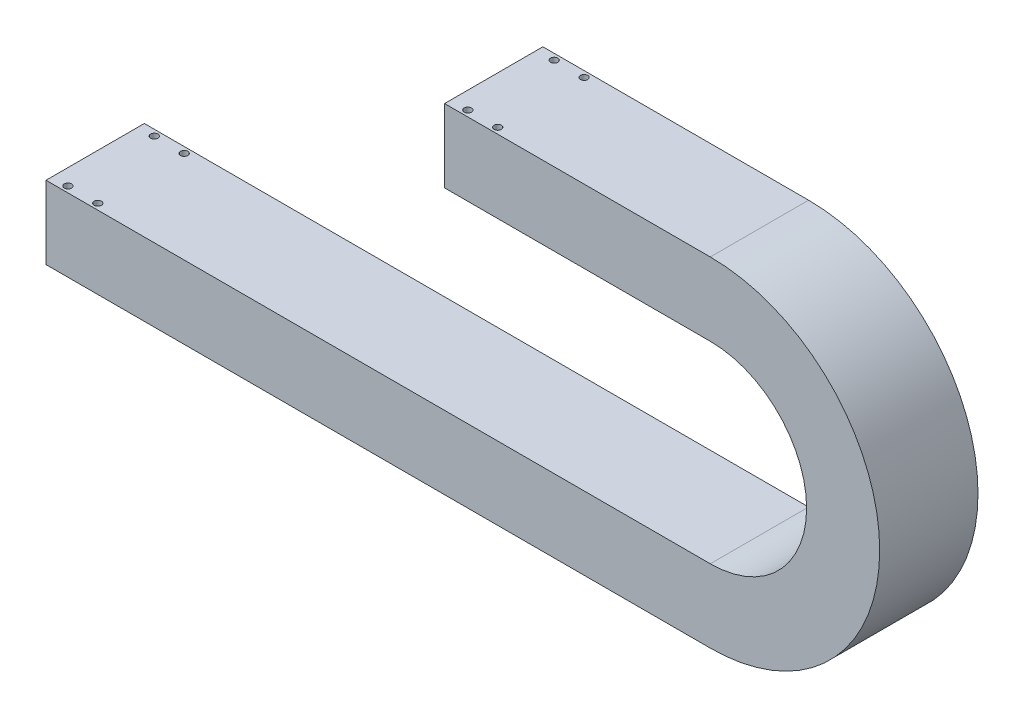
ISO-10303-21;
HEADER;
FILE_DESCRIPTION(('STEP AP214'),'2;1');
FILE_NAME('part.step','',(''),(''),'','','');
FILE_SCHEMA(('AUTOMOTIVE_DESIGN { 1 0 10303 214 1 1 1 1 }'));
ENDSEC;
DATA;
#1=APPLICATION_CONTEXT('core data for automotive mechanical design processes');
#2=APPLICATION_PROTOCOL_DEFINITION('international standard','automotive_design',2000,#1);
#3=PRODUCT_CONTEXT('',#1,'mechanical');
#4=PRODUCT('Part','Part','',(#3));
#5=PRODUCT_RELATED_PRODUCT_CATEGORY('part','',(#4));
#6=PRODUCT_DEFINITION_FORMATION('','',#4);
#7=PRODUCT_DEFINITION_CONTEXT('part definition',#1,'design');
#8=PRODUCT_DEFINITION('design','',#6,#7);
#9=PRODUCT_DEFINITION_SHAPE('','',#8);
#10=(LENGTH_UNIT() NAMED_UNIT(*) SI_UNIT(.MILLI.,.METRE.));
#11=(NAMED_UNIT(*) PLANE_ANGLE_UNIT() SI_UNIT($,.RADIAN.));
#12=(NAMED_UNIT(*) SI_UNIT($,.STERADIAN.) SOLID_ANGLE_UNIT());
#13=UNCERTAINTY_MEASURE_WITH_UNIT(LENGTH_MEASURE(1.E-05),#10,'distance_accuracy_value','');
#14=(GEOMETRIC_REPRESENTATION_CONTEXT(3) GLOBAL_UNCERTAINTY_ASSIGNED_CONTEXT((#13)) GLOBAL_UNIT_ASSIGNED_CONTEXT((#10,
#11,#12)) REPRESENTATION_CONTEXT('',''));
#15=CARTESIAN_POINT('',(0.,0.,0.));
#16=DIRECTION('',(0.,0.,1.));
#17=DIRECTION('',(1.,0.,0.));
#18=AXIS2_PLACEMENT_3D('',#15,#16,#17);
#19=CARTESIAN_POINT('',(500.,172.5,37.));
#20=DIRECTION('',(0.,-1.,0.));
#21=DIRECTION('',(0.,0.,-1.));
#22=AXIS2_PLACEMENT_3D('',#19,#20,#21);
#23=PLANE('',#22);
#24=CARTESIAN_POINT('',(313.,172.5,-32.5));
#25=DIRECTION('',(0.,-1.,0.));
#26=DIRECTION('',(0.,0.,-1.));
#27=AXIS2_PLACEMENT_3D('',#24,#25,#26);
#28=CIRCLE('',#27,2.74999999999997);
#29=CARTESIAN_POINT('',(313.,172.5,-35.25));
#30=VERTEX_POINT('',#29);
#31=EDGE_CURVE('E341',#30,#30,#28,.F.);
#32=ORIENTED_EDGE('',*,*,#31,.T.);
#33=EDGE_LOOP('',(#32));
#34=FACE_BOUND('',#33,.T.);
#35=CARTESIAN_POINT('',(335.5,172.5,-32.5));
#36=DIRECTION('',(0.,-1.,0.));
#37=DIRECTION('',(0.,0.,-1.));
#38=AXIS2_PLACEMENT_3D('',#35,#36,#37);
#39=CIRCLE('',#38,2.74999999999997);
#40=CARTESIAN_POINT('',(335.5,172.5,-35.25));
#41=VERTEX_POINT('',#40);
#42=EDGE_CURVE('E345',#41,#41,#39,.F.);
#43=ORIENTED_EDGE('',*,*,#42,.T.);
#44=EDGE_LOOP('',(#43));
#45=FACE_BOUND('',#44,.T.);
#46=CARTESIAN_POINT('',(335.5,172.5,32.5));
#47=DIRECTION('',(0.,-1.,0.));
#48=DIRECTION('',(0.,0.,-1.));
#49=AXIS2_PLACEMENT_3D('',#46,#47,#48);
#50=CIRCLE('',#49,2.74999999999997);
#51=CARTESIAN_POINT('',(335.5,172.5,29.75));
#52=VERTEX_POINT('',#51);
#53=EDGE_CURVE('E348',#52,#52,#50,.F.);
#54=ORIENTED_EDGE('',*,*,#53,.T.);
#55=EDGE_LOOP('',(#54));
#56=FACE_BOUND('',#55,.T.);
#57=DIRECTION('',(1.,0.,0.));
#58=VECTOR('',#57,1.);
#59=CARTESIAN_POINT('',(500.,172.5,-37.));
#60=LINE('',#59,#58);
#61=CARTESIAN_POINT('',(500.,172.5,-37.));
#62=VERTEX_POINT('',#61);
#63=CARTESIAN_POINT('',(300.,172.5,-37.));
#64=VERTEX_POINT('',#63);
#65=EDGE_CURVE('E252',#62,#64,#60,.F.);
#66=ORIENTED_EDGE('',*,*,#65,.F.);
#67=DIRECTION('',(0.,0.,-1.));
#68=VECTOR('',#67,1.);
#69=CARTESIAN_POINT('',(500.,172.5,37.));
#70=LINE('',#69,#68);
#71=CARTESIAN_POINT('',(500.,172.5,37.));
#72=VERTEX_POINT('',#71);
#73=EDGE_CURVE('E278',#72,#62,#70,.T.);
#74=ORIENTED_EDGE('',*,*,#73,.F.);
#75=DIRECTION('',(1.,0.,0.));
#76=VECTOR('',#75,1.);
#77=CARTESIAN_POINT('',(500.,172.5,37.));
#78=LINE('',#77,#76);
#79=CARTESIAN_POINT('',(300.,172.5,37.));
#80=VERTEX_POINT('',#79);
#81=EDGE_CURVE('E230',#72,#80,#78,.F.);
#82=ORIENTED_EDGE('',*,*,#81,.T.);
#83=DIRECTION('',(0.,0.,-1.));
#84=VECTOR('',#83,1.);
#85=CARTESIAN_POINT('',(300.,172.5,37.));
#86=LINE('',#85,#84);
#87=EDGE_CURVE('E43',#80,#64,#86,.T.);
#88=ORIENTED_EDGE('',*,*,#87,.T.);
#89=EDGE_LOOP('',(#66,#74,#82,#88));
#90=FACE_BOUND('',#89,.T.);
#91=CARTESIAN_POINT('',(313.,172.5,32.5));
#92=DIRECTION('',(0.,-1.,0.));
#93=DIRECTION('',(0.,0.,-1.));
#94=AXIS2_PLACEMENT_3D('',#91,#92,#93);
#95=CIRCLE('',#94,2.74999999999997);
#96=CARTESIAN_POINT('',(313.,172.5,29.75));
#97=VERTEX_POINT('',#96);
#98=EDGE_CURVE('E354',#97,#97,#95,.F.);
#99=ORIENTED_EDGE('',*,*,#98,.T.);
#100=EDGE_LOOP('',(#99));
#101=FACE_BOUND('',#100,.T.);
#102=ADVANCED_FACE('F35',(#34,#45,#56,#90,#101),#23,.T.);
#103=CARTESIAN_POINT('',(300.,172.5,37.));
#104=DIRECTION('',(-1.,0.,0.));
#105=DIRECTION('',(0.,0.,1.));
#106=AXIS2_PLACEMENT_3D('',#103,#104,#105);
#107=PLANE('',#106);
#108=DIRECTION('',(0.,1.,0.));
#109=VECTOR('',#108,1.);
#110=CARTESIAN_POINT('',(300.,172.5,-37.));
#111=LINE('',#110,#109);
#112=CARTESIAN_POINT('',(300.,227.5,-37.));
#113=VERTEX_POINT('',#112);
#114=EDGE_CURVE('E249',#64,#113,#111,.T.);
#115=ORIENTED_EDGE('',*,*,#114,.F.);
#116=ORIENTED_EDGE('',*,*,#87,.F.);
#117=DIRECTION('',(0.,1.,0.));
#118=VECTOR('',#117,1.);
#119=CARTESIAN_POINT('',(300.,172.5,37.));
#120=LINE('',#119,#118);
#121=CARTESIAN_POINT('',(300.,227.5,37.));
#122=VERTEX_POINT('',#121);
#123=EDGE_CURVE('E226',#80,#122,#120,.T.);
#124=ORIENTED_EDGE('',*,*,#123,.T.);
#125=DIRECTION('',(0.,0.,-1.));
#126=VECTOR('',#125,1.);
#127=CARTESIAN_POINT('',(300.,227.5,37.));
#128=LINE('',#127,#126);
#129=EDGE_CURVE('E11',#122,#113,#128,.T.);
#130=ORIENTED_EDGE('',*,*,#129,.T.);
#131=EDGE_LOOP('',(#115,#116,#124,#130));
#132=FACE_BOUND('',#131,.T.);
#133=DIRECTION('',(0.,0.,-1.));
#134=VECTOR('',#133,1.);
#135=CARTESIAN_POINT('',(300.,184.5,37.));
#136=LINE('',#135,#134);
#137=CARTESIAN_POINT('',(300.,184.5,25.));
#138=VERTEX_POINT('',#137);
#139=CARTESIAN_POINT('',(300.,184.5,-25.));
#140=VERTEX_POINT('',#139);
#141=EDGE_CURVE('E204',#138,#140,#136,.T.);
#142=ORIENTED_EDGE('',*,*,#141,.T.);
#143=DIRECTION('',(0.,1.,0.));
#144=VECTOR('',#143,1.);
#145=CARTESIAN_POINT('',(300.,172.5,-25.));
#146=LINE('',#145,#144);
#147=CARTESIAN_POINT('',(300.,215.5,-25.));
#148=VERTEX_POINT('',#147);
#149=EDGE_CURVE('E174',#140,#148,#146,.T.);
#150=ORIENTED_EDGE('',*,*,#149,.T.);
#151=DIRECTION('',(0.,0.,-1.));
#152=VECTOR('',#151,1.);
#153=CARTESIAN_POINT('',(300.,215.5,37.));
#154=LINE('',#153,#152);
#155=CARTESIAN_POINT('',(300.,215.5,25.));
#156=VERTEX_POINT('',#155);
#157=EDGE_CURVE('E173',#156,#148,#154,.T.);
#158=ORIENTED_EDGE('',*,*,#157,.F.);
#159=DIRECTION('',(0.,1.,0.));
#160=VECTOR('',#159,1.);
#161=CARTESIAN_POINT('',(300.,172.5,25.));
#162=LINE('',#161,#160);
#163=EDGE_CURVE('E50',#138,#156,#162,.T.);
#164=ORIENTED_EDGE('',*,*,#163,.F.);
#165=EDGE_LOOP('',(#142,#150,#158,#164));
#166=FACE_BOUND('',#165,.T.);
#167=ADVANCED_FACE('F286',(#132,#166),#107,.T.);
#168=CARTESIAN_POINT('',(0.,-27.5,37.));
#169=DIRECTION('',(-1.,0.,0.));
#170=DIRECTION('',(0.,0.,1.));
#171=AXIS2_PLACEMENT_3D('',#168,#169,#170);
#172=PLANE('',#171);
#173=DIRECTION('',(0.,1.,0.));
#174=VECTOR('',#173,1.);
#175=CARTESIAN_POINT('',(0.,-27.5,-37.));
#176=LINE('',#175,#174);
#177=CARTESIAN_POINT('',(0.,-27.5,-37.));
#178=VERTEX_POINT('',#177);
#179=CARTESIAN_POINT('',(0.,27.5,-37.));
#180=VERTEX_POINT('',#179);
#181=EDGE_CURVE('E261',#178,#180,#176,.T.);
#182=ORIENTED_EDGE('',*,*,#181,.F.);
#183=DIRECTION('',(0.,0.,-1.));
#184=VECTOR('',#183,1.);
#185=CARTESIAN_POINT('',(0.,-27.5,37.));
#186=LINE('',#185,#184);
#187=CARTESIAN_POINT('',(0.,-27.5,37.));
#188=VERTEX_POINT('',#187);
#189=EDGE_CURVE('E272',#188,#178,#186,.T.);
#190=ORIENTED_EDGE('',*,*,#189,.F.);
#191=DIRECTION('',(0.,1.,0.));
#192=VECTOR('',#191,1.);
#193=CARTESIAN_POINT('',(0.,-27.5,37.));
#194=LINE('',#193,#192);
#195=CARTESIAN_POINT('',(0.,27.5,37.));
#196=VERTEX_POINT('',#195);
#197=EDGE_CURVE('E239',#188,#196,#194,.T.);
#198=ORIENTED_EDGE('',*,*,#197,.T.);
#199=DIRECTION('',(0.,0.,-1.));
#200=VECTOR('',#199,1.);
#201=CARTESIAN_POINT('',(0.,27.5,37.));
#202=LINE('',#201,#200);
#203=EDGE_CURVE('E274',#196,#180,#202,.T.);
#204=ORIENTED_EDGE('',*,*,#203,.T.);
#205=EDGE_LOOP('',(#182,#190,#198,#204));
#206=FACE_BOUND('',#205,.T.);
#207=DIRECTION('',(0.,0.,-1.));
#208=VECTOR('',#207,1.);
#209=CARTESIAN_POINT('',(0.,-15.5,37.));
#210=LINE('',#209,#208);
#211=CARTESIAN_POINT('',(0.,-15.5,25.));
#212=VERTEX_POINT('',#211);
#213=CARTESIAN_POINT('',(0.,-15.5,-25.));
#214=VERTEX_POINT('',#213);
#215=EDGE_CURVE('E188',#212,#214,#210,.T.);
#216=ORIENTED_EDGE('',*,*,#215,.T.);
#217=DIRECTION('',(0.,1.,0.));
#218=VECTOR('',#217,1.);
#219=CARTESIAN_POINT('',(0.,-27.5,-25.));
#220=LINE('',#219,#218);
#221=CARTESIAN_POINT('',(0.,15.5,-25.));
#222=VERTEX_POINT('',#221);
#223=EDGE_CURVE('E190',#214,#222,#220,.T.);
#224=ORIENTED_EDGE('',*,*,#223,.T.);
#225=DIRECTION('',(0.,0.,-1.));
#226=VECTOR('',#225,1.);
#227=CARTESIAN_POINT('',(0.,15.5,37.));
#228=LINE('',#227,#226);
#229=CARTESIAN_POINT('',(0.,15.5,25.));
#230=VERTEX_POINT('',#229);
#231=EDGE_CURVE('E210',#230,#222,#228,.T.);
#232=ORIENTED_EDGE('',*,*,#231,.F.);
#233=DIRECTION('',(0.,1.,0.));
#234=VECTOR('',#233,1.);
#235=CARTESIAN_POINT('',(0.,-27.5,25.));
#236=LINE('',#235,#234);
#237=EDGE_CURVE('E57',#212,#230,#236,.T.);
#238=ORIENTED_EDGE('',*,*,#237,.F.);
#239=EDGE_LOOP('',(#216,#224,#232,#238));
#240=FACE_BOUND('',#239,.T.);
#241=ADVANCED_FACE('F315',(#206,#240),#172,.T.);
#242=CARTESIAN_POINT('',(500.,227.5,37.));
#243=DIRECTION('',(0.,-1.,0.));
#244=DIRECTION('',(0.,0.,-1.));
#245=AXIS2_PLACEMENT_3D('',#242,#243,#244);
#246=PLANE('',#245);
#247=CARTESIAN_POINT('',(313.,227.5,-32.5));
#248=DIRECTION('',(0.,1.,0.));
#249=DIRECTION('',(0.,0.,1.));
#250=AXIS2_PLACEMENT_3D('',#247,#248,#249);
#251=CIRCLE('',#250,2.74999999999997);
#252=CARTESIAN_POINT('',(313.,227.5,-29.75));
#253=VERTEX_POINT('',#252);
#254=EDGE_CURVE('E437',#253,#253,#251,.T.);
#255=ORIENTED_EDGE('',*,*,#254,.F.);
#256=EDGE_LOOP('',(#255));
#257=FACE_BOUND('',#256,.T.);
#258=CARTESIAN_POINT('',(335.5,227.5,-32.5));
#259=DIRECTION('',(0.,1.,0.));
#260=DIRECTION('',(0.,0.,1.));
#261=AXIS2_PLACEMENT_3D('',#258,#259,#260);
#262=CIRCLE('',#261,2.74999999999997);
#263=CARTESIAN_POINT('',(335.5,227.5,-29.75));
#264=VERTEX_POINT('',#263);
#265=EDGE_CURVE('E441',#264,#264,#262,.T.);
#266=ORIENTED_EDGE('',*,*,#265,.F.);
#267=EDGE_LOOP('',(#266));
#268=FACE_BOUND('',#267,.T.);
#269=CARTESIAN_POINT('',(335.5,227.5,32.5));
#270=DIRECTION('',(0.,1.,0.));
#271=DIRECTION('',(0.,0.,1.));
#272=AXIS2_PLACEMENT_3D('',#269,#270,#271);
#273=CIRCLE('',#272,2.74999999999997);
#274=CARTESIAN_POINT('',(335.5,227.5,35.25));
#275=VERTEX_POINT('',#274);
#276=EDGE_CURVE('E351',#275,#275,#273,.T.);
#277=ORIENTED_EDGE('',*,*,#276,.F.);
#278=EDGE_LOOP('',(#277));
#279=FACE_BOUND('',#278,.T.);
#280=CARTESIAN_POINT('',(313.,227.5,32.5));
#281=DIRECTION('',(0.,1.,0.));
#282=DIRECTION('',(0.,0.,1.));
#283=AXIS2_PLACEMENT_3D('',#280,#281,#282);
#284=CIRCLE('',#283,2.74999999999997);
#285=CARTESIAN_POINT('',(313.,227.5,35.25));
#286=VERTEX_POINT('',#285);
#287=EDGE_CURVE('E350',#286,#286,#284,.T.);
#288=ORIENTED_EDGE('',*,*,#287,.F.);
#289=EDGE_LOOP('',(#288));
#290=FACE_BOUND('',#289,.T.);
#291=DIRECTION('',(1.,0.,0.));
#292=VECTOR('',#291,1.);
#293=CARTESIAN_POINT('',(500.,227.5,-37.));
#294=LINE('',#293,#292);
#295=CARTESIAN_POINT('',(500.,227.5,-37.));
#296=VERTEX_POINT('',#295);
#297=EDGE_CURVE('E213',#296,#113,#294,.F.);
#298=ORIENTED_EDGE('',*,*,#297,.T.);
#299=ORIENTED_EDGE('',*,*,#129,.F.);
#300=DIRECTION('',(1.,0.,0.));
#301=VECTOR('',#300,1.);
#302=CARTESIAN_POINT('',(500.,227.5,37.));
#303=LINE('',#302,#301);
#304=CARTESIAN_POINT('',(500.,227.5,37.));
#305=VERTEX_POINT('',#304);
#306=EDGE_CURVE('E224',#305,#122,#303,.F.);
#307=ORIENTED_EDGE('',*,*,#306,.F.);
#308=DIRECTION('',(0.,0.,-1.));
#309=VECTOR('',#308,1.);
#310=CARTESIAN_POINT('',(500.,227.5,37.));
#311=LINE('',#310,#309);
#312=EDGE_CURVE('E246',#305,#296,#311,.T.);
#313=ORIENTED_EDGE('',*,*,#312,.T.);
#314=EDGE_LOOP('',(#298,#299,#307,#313));
#315=FACE_BOUND('',#314,.T.);
#316=ADVANCED_FACE('F37',(#257,#268,#279,#290,#315),#246,.F.);
#317=CARTESIAN_POINT('',(500.,100.,37.));
#318=DIRECTION('',(0.,0.,-1.));
#319=DIRECTION('',(-1.,0.,0.));
#320=AXIS2_PLACEMENT_3D('',#317,#318,#319);
#321=CYLINDRICAL_SURFACE('',#320,72.5);
#322=CARTESIAN_POINT('',(500.,100.,-37.));
#323=DIRECTION('',(0.,0.,1.));
#324=DIRECTION('',(1.,0.,0.));
#325=AXIS2_PLACEMENT_3D('',#322,#323,#324);
#326=CIRCLE('',#325,72.5);
#327=CARTESIAN_POINT('',(500.,27.5,-37.));
#328=VERTEX_POINT('',#327);
#329=EDGE_CURVE('E255',#328,#62,#326,.T.);
#330=ORIENTED_EDGE('',*,*,#329,.F.);
#331=DIRECTION('',(0.,0.,-1.));
#332=VECTOR('',#331,1.);
#333=CARTESIAN_POINT('',(500.,27.5,37.));
#334=LINE('',#333,#332);
#335=CARTESIAN_POINT('',(500.,27.5,37.));
#336=VERTEX_POINT('',#335);
#337=EDGE_CURVE('E276',#336,#328,#334,.T.);
#338=ORIENTED_EDGE('',*,*,#337,.F.);
#339=CARTESIAN_POINT('',(500.,100.,37.));
#340=DIRECTION('',(0.,0.,1.));
#341=DIRECTION('',(1.,0.,0.));
#342=AXIS2_PLACEMENT_3D('',#339,#340,#341);
#343=CIRCLE('',#342,72.5);
#344=EDGE_CURVE('E233',#336,#72,#343,.T.);
#345=ORIENTED_EDGE('',*,*,#344,.T.);
#346=ORIENTED_EDGE('',*,*,#73,.T.);
#347=EDGE_LOOP('',(#330,#338,#345,#346));
#348=FACE_BOUND('',#347,.T.);
#349=ADVANCED_FACE('F295',(#348),#321,.F.);
#350=CARTESIAN_POINT('',(0.,27.5,37.));
#351=DIRECTION('',(0.,1.,0.));
#352=DIRECTION('',(0.,0.,1.));
#353=AXIS2_PLACEMENT_3D('',#350,#351,#352);
#354=PLANE('',#353);
#355=CARTESIAN_POINT('',(12.,27.5,-32.5));
#356=DIRECTION('',(0.,1.,0.));
#357=DIRECTION('',(0.,0.,1.));
#358=AXIS2_PLACEMENT_3D('',#355,#356,#357);
#359=CIRCLE('',#358,2.74999999999999);
#360=CARTESIAN_POINT('',(12.,27.5,-29.75));
#361=VERTEX_POINT('',#360);
#362=EDGE_CURVE('E362',#361,#361,#359,.T.);
#363=ORIENTED_EDGE('',*,*,#362,.F.);
#364=EDGE_LOOP('',(#363));
#365=FACE_BOUND('',#364,.T.);
#366=CARTESIAN_POINT('',(34.5,27.5,-32.5));
#367=DIRECTION('',(0.,1.,0.));
#368=DIRECTION('',(0.,0.,1.));
#369=AXIS2_PLACEMENT_3D('',#366,#367,#368);
#370=CIRCLE('',#369,2.75);
#371=CARTESIAN_POINT('',(34.5,27.5,-29.75));
#372=VERTEX_POINT('',#371);
#373=EDGE_CURVE('E368',#372,#372,#370,.T.);
#374=ORIENTED_EDGE('',*,*,#373,.F.);
#375=EDGE_LOOP('',(#374));
#376=FACE_BOUND('',#375,.T.);
#377=CARTESIAN_POINT('',(34.5,27.5,32.5));
#378=DIRECTION('',(0.,1.,0.));
#379=DIRECTION('',(0.,0.,1.));
#380=AXIS2_PLACEMENT_3D('',#377,#378,#379);
#381=CIRCLE('',#380,2.75);
#382=CARTESIAN_POINT('',(34.5,27.5,35.25));
#383=VERTEX_POINT('',#382);
#384=EDGE_CURVE('E374',#383,#383,#381,.T.);
#385=ORIENTED_EDGE('',*,*,#384,.F.);
#386=EDGE_LOOP('',(#385));
#387=FACE_BOUND('',#386,.T.);
#388=CARTESIAN_POINT('',(12.,27.5,32.5));
#389=DIRECTION('',(0.,1.,0.));
#390=DIRECTION('',(0.,0.,1.));
#391=AXIS2_PLACEMENT_3D('',#388,#389,#390);
#392=CIRCLE('',#391,2.74999999999999);
#393=CARTESIAN_POINT('',(12.,27.5,35.25));
#394=VERTEX_POINT('',#393);
#395=EDGE_CURVE('E180',#394,#394,#392,.T.);
#396=ORIENTED_EDGE('',*,*,#395,.F.);
#397=EDGE_LOOP('',(#396));
#398=FACE_BOUND('',#397,.T.);
#399=DIRECTION('',(1.,0.,0.));
#400=VECTOR('',#399,1.);
#401=CARTESIAN_POINT('',(0.,27.5,-37.));
#402=LINE('',#401,#400);
#403=EDGE_CURVE('E258',#180,#328,#402,.T.);
#404=ORIENTED_EDGE('',*,*,#403,.F.);
#405=ORIENTED_EDGE('',*,*,#203,.F.);
#406=DIRECTION('',(1.,0.,0.));
#407=VECTOR('',#406,1.);
#408=CARTESIAN_POINT('',(0.,27.5,37.));
#409=LINE('',#408,#407);
#410=EDGE_CURVE('E236',#196,#336,#409,.T.);
#411=ORIENTED_EDGE('',*,*,#410,.T.);
#412=ORIENTED_EDGE('',*,*,#337,.T.);
#413=EDGE_LOOP('',(#404,#405,#411,#412));
#414=FACE_BOUND('',#413,.T.);
#415=ADVANCED_FACE('F318',(#365,#376,#387,#398,#414),#354,.T.);
#416=CARTESIAN_POINT('',(0.,-27.5,37.));
#417=DIRECTION('',(0.,1.,0.));
#418=DIRECTION('',(0.,0.,1.));
#419=AXIS2_PLACEMENT_3D('',#416,#417,#418);
#420=PLANE('',#419);
#421=CARTESIAN_POINT('',(12.,-27.5,-32.5));
#422=DIRECTION('',(0.,1.,0.));
#423=DIRECTION('',(0.,0.,1.));
#424=AXIS2_PLACEMENT_3D('',#421,#422,#423);
#425=CIRCLE('',#424,2.74999999999999);
#426=CARTESIAN_POINT('',(12.,-27.5,-29.75));
#427=VERTEX_POINT('',#426);
#428=EDGE_CURVE('E365',#427,#427,#425,.T.);
#429=ORIENTED_EDGE('',*,*,#428,.T.);
#430=EDGE_LOOP('',(#429));
#431=FACE_BOUND('',#430,.T.);
#432=CARTESIAN_POINT('',(34.5,-27.5,-32.5));
#433=DIRECTION('',(0.,1.,0.));
#434=DIRECTION('',(0.,0.,1.));
#435=AXIS2_PLACEMENT_3D('',#432,#433,#434);
#436=CIRCLE('',#435,2.74999999999999);
#437=CARTESIAN_POINT('',(34.5,-27.5,-29.75));
#438=VERTEX_POINT('',#437);
#439=EDGE_CURVE('E371',#438,#438,#436,.T.);
#440=ORIENTED_EDGE('',*,*,#439,.T.);
#441=EDGE_LOOP('',(#440));
#442=FACE_BOUND('',#441,.T.);
#443=CARTESIAN_POINT('',(34.5,-27.5,32.5));
#444=DIRECTION('',(0.,1.,0.));
#445=DIRECTION('',(0.,0.,1.));
#446=AXIS2_PLACEMENT_3D('',#443,#444,#445);
#447=CIRCLE('',#446,2.74999999999999);
#448=CARTESIAN_POINT('',(34.5,-27.5,35.25));
#449=VERTEX_POINT('',#448);
#450=EDGE_CURVE('E377',#449,#449,#447,.T.);
#451=ORIENTED_EDGE('',*,*,#450,.T.);
#452=EDGE_LOOP('',(#451));
#453=FACE_BOUND('',#452,.T.);
#454=CARTESIAN_POINT('',(12.,-27.5,32.5));
#455=DIRECTION('',(0.,1.,0.));
#456=DIRECTION('',(0.,0.,1.));
#457=AXIS2_PLACEMENT_3D('',#454,#455,#456);
#458=CIRCLE('',#457,2.74999999999999);
#459=CARTESIAN_POINT('',(12.,-27.5,35.25));
#460=VERTEX_POINT('',#459);
#461=EDGE_CURVE('E175',#460,#460,#458,.T.);
#462=ORIENTED_EDGE('',*,*,#461,.T.);
#463=EDGE_LOOP('',(#462));
#464=FACE_BOUND('',#463,.T.);
#465=DIRECTION('',(1.,0.,0.));
#466=VECTOR('',#465,1.);
#467=CARTESIAN_POINT('',(0.,-27.5,-37.));
#468=LINE('',#467,#466);
#469=CARTESIAN_POINT('',(500.,-27.5,-37.));
#470=VERTEX_POINT('',#469);
#471=EDGE_CURVE('E264',#178,#470,#468,.T.);
#472=ORIENTED_EDGE('',*,*,#471,.T.);
#473=DIRECTION('',(0.,0.,-1.));
#474=VECTOR('',#473,1.);
#475=CARTESIAN_POINT('',(500.,-27.5,37.));
#476=LINE('',#475,#474);
#477=CARTESIAN_POINT('',(500.,-27.5,37.));
#478=VERTEX_POINT('',#477);
#479=EDGE_CURVE('E269',#478,#470,#476,.T.);
#480=ORIENTED_EDGE('',*,*,#479,.F.);
#481=DIRECTION('',(1.,0.,0.));
#482=VECTOR('',#481,1.);
#483=CARTESIAN_POINT('',(0.,-27.5,37.));
#484=LINE('',#483,#482);
#485=EDGE_CURVE('E242',#188,#478,#484,.T.);
#486=ORIENTED_EDGE('',*,*,#485,.F.);
#487=ORIENTED_EDGE('',*,*,#189,.T.);
#488=EDGE_LOOP('',(#472,#480,#486,#487));
#489=FACE_BOUND('',#488,.T.);
#490=ADVANCED_FACE('F312',(#431,#442,#453,#464,#489),#420,.F.);
#491=CARTESIAN_POINT('',(500.,100.,37.));
#492=DIRECTION('',(0.,0.,-1.));
#493=DIRECTION('',(-1.,0.,0.));
#494=AXIS2_PLACEMENT_3D('',#491,#492,#493);
#495=CYLINDRICAL_SURFACE('',#494,127.5);
#496=CARTESIAN_POINT('',(500.,100.,-37.));
#497=DIRECTION('',(0.,0.,1.));
#498=DIRECTION('',(1.,0.,0.));
#499=AXIS2_PLACEMENT_3D('',#496,#497,#498);
#500=CIRCLE('',#499,127.5);
#501=EDGE_CURVE('E227',#470,#296,#500,.T.);
#502=ORIENTED_EDGE('',*,*,#501,.T.);
#503=ORIENTED_EDGE('',*,*,#312,.F.);
#504=CARTESIAN_POINT('',(500.,100.,37.));
#505=DIRECTION('',(0.,0.,1.));
#506=DIRECTION('',(1.,0.,0.));
#507=AXIS2_PLACEMENT_3D('',#504,#505,#506);
#508=CIRCLE('',#507,127.5);
#509=EDGE_CURVE('E244',#478,#305,#508,.T.);
#510=ORIENTED_EDGE('',*,*,#509,.F.);
#511=ORIENTED_EDGE('',*,*,#479,.T.);
#512=EDGE_LOOP('',(#502,#503,#510,#511));
#513=FACE_BOUND('',#512,.T.);
#514=ADVANCED_FACE('F308',(#513),#495,.T.);
#515=CARTESIAN_POINT('',(500.,100.,37.));
#516=DIRECTION('',(0.,0.,1.));
#517=DIRECTION('',(1.,0.,0.));
#518=AXIS2_PLACEMENT_3D('',#515,#516,#517);
#519=PLANE('',#518);
#520=ORIENTED_EDGE('',*,*,#306,.T.);
#521=ORIENTED_EDGE('',*,*,#123,.F.);
#522=ORIENTED_EDGE('',*,*,#81,.F.);
#523=ORIENTED_EDGE('',*,*,#344,.F.);
#524=ORIENTED_EDGE('',*,*,#410,.F.);
#525=ORIENTED_EDGE('',*,*,#197,.F.);
#526=ORIENTED_EDGE('',*,*,#485,.T.);
#527=ORIENTED_EDGE('',*,*,#509,.T.);
#528=EDGE_LOOP('',(#520,#521,#522,#523,#524,#525,#526,#527));
#529=FACE_BOUND('',#528,.T.);
#530=ADVANCED_FACE('F298',(#529),#519,.T.);
#531=CARTESIAN_POINT('',(500.,100.,-37.));
#532=DIRECTION('',(0.,0.,1.));
#533=DIRECTION('',(1.,0.,0.));
#534=AXIS2_PLACEMENT_3D('',#531,#532,#533);
#535=PLANE('',#534);
#536=ORIENTED_EDGE('',*,*,#297,.F.);
#537=ORIENTED_EDGE('',*,*,#501,.F.);
#538=ORIENTED_EDGE('',*,*,#471,.F.);
#539=ORIENTED_EDGE('',*,*,#181,.T.);
#540=ORIENTED_EDGE('',*,*,#403,.T.);
#541=ORIENTED_EDGE('',*,*,#329,.T.);
#542=ORIENTED_EDGE('',*,*,#65,.T.);
#543=ORIENTED_EDGE('',*,*,#114,.T.);
#544=EDGE_LOOP('',(#536,#537,#538,#539,#540,#541,#542,#543));
#545=FACE_BOUND('',#544,.T.);
#546=ADVANCED_FACE('F291',(#545),#535,.F.);
#547=CARTESIAN_POINT('',(500.,215.5,37.));
#548=DIRECTION('',(0.,-1.,0.));
#549=DIRECTION('',(0.,0.,-1.));
#550=AXIS2_PLACEMENT_3D('',#547,#548,#549);
#551=PLANE('',#550);
#552=DIRECTION('',(-1.,0.,0.));
#553=VECTOR('',#552,1.);
#554=CARTESIAN_POINT('',(500.,215.5,-25.));
#555=LINE('',#554,#553);
#556=CARTESIAN_POINT('',(500.,215.5,-25.));
#557=VERTEX_POINT('',#556);
#558=EDGE_CURVE('E154',#557,#148,#555,.T.);
#559=ORIENTED_EDGE('',*,*,#558,.F.);
#560=DIRECTION('',(0.,0.,-1.));
#561=VECTOR('',#560,1.);
#562=CARTESIAN_POINT('',(500.,215.5,37.));
#563=LINE('',#562,#561);
#564=CARTESIAN_POINT('',(500.,215.5,25.));
#565=VERTEX_POINT('',#564);
#566=EDGE_CURVE('E164',#565,#557,#563,.T.);
#567=ORIENTED_EDGE('',*,*,#566,.F.);
#568=DIRECTION('',(-1.,0.,0.));
#569=VECTOR('',#568,1.);
#570=CARTESIAN_POINT('',(500.,215.5,25.));
#571=LINE('',#570,#569);
#572=EDGE_CURVE('E161',#565,#156,#571,.T.);
#573=ORIENTED_EDGE('',*,*,#572,.T.);
#574=ORIENTED_EDGE('',*,*,#157,.T.);
#575=EDGE_LOOP('',(#559,#567,#573,#574));
#576=FACE_BOUND('',#575,.T.);
#577=ADVANCED_FACE('F171',(#576),#551,.T.);
#578=CARTESIAN_POINT('',(500.,184.5,37.));
#579=DIRECTION('',(0.,-1.,0.));
#580=DIRECTION('',(0.,0.,-1.));
#581=AXIS2_PLACEMENT_3D('',#578,#579,#580);
#582=PLANE('',#581);
#583=DIRECTION('',(-1.,0.,0.));
#584=VECTOR('',#583,1.);
#585=CARTESIAN_POINT('',(500.,184.5,-25.));
#586=LINE('',#585,#584);
#587=CARTESIAN_POINT('',(500.,184.5,-25.));
#588=VERTEX_POINT('',#587);
#589=EDGE_CURVE('E177',#588,#140,#586,.T.);
#590=ORIENTED_EDGE('',*,*,#589,.T.);
#591=ORIENTED_EDGE('',*,*,#141,.F.);
#592=DIRECTION('',(-1.,0.,0.));
#593=VECTOR('',#592,1.);
#594=CARTESIAN_POINT('',(500.,184.5,25.));
#595=LINE('',#594,#593);
#596=CARTESIAN_POINT('',(500.,184.5,25.));
#597=VERTEX_POINT('',#596);
#598=EDGE_CURVE('E192',#597,#138,#595,.T.);
#599=ORIENTED_EDGE('',*,*,#598,.F.);
#600=DIRECTION('',(0.,0.,-1.));
#601=VECTOR('',#600,1.);
#602=CARTESIAN_POINT('',(500.,184.5,37.));
#603=LINE('',#602,#601);
#604=EDGE_CURVE('E202',#597,#588,#603,.T.);
#605=ORIENTED_EDGE('',*,*,#604,.T.);
#606=EDGE_LOOP('',(#590,#591,#599,#605));
#607=FACE_BOUND('',#606,.T.);
#608=ADVANCED_FACE('F402',(#607),#582,.F.);
#609=CARTESIAN_POINT('',(500.,100.,37.));
#610=DIRECTION('',(0.,0.,-1.));
#611=DIRECTION('',(-1.,0.,0.));
#612=AXIS2_PLACEMENT_3D('',#609,#610,#611);
#613=CYLINDRICAL_SURFACE('',#612,84.5);
#614=CARTESIAN_POINT('',(500.,100.,-25.));
#615=DIRECTION('',(0.,0.,1.));
#616=DIRECTION('',(1.,0.,0.));
#617=AXIS2_PLACEMENT_3D('',#614,#615,#616);
#618=CIRCLE('',#617,84.5);
#619=CARTESIAN_POINT('',(500.,15.5,-25.));
#620=VERTEX_POINT('',#619);
#621=EDGE_CURVE('E201',#620,#588,#618,.T.);
#622=ORIENTED_EDGE('',*,*,#621,.T.);
#623=ORIENTED_EDGE('',*,*,#604,.F.);
#624=CARTESIAN_POINT('',(500.,100.,25.));
#625=DIRECTION('',(0.,0.,1.));
#626=DIRECTION('',(1.,0.,0.));
#627=AXIS2_PLACEMENT_3D('',#624,#625,#626);
#628=CIRCLE('',#627,84.5);
#629=CARTESIAN_POINT('',(500.,15.5,25.));
#630=VERTEX_POINT('',#629);
#631=EDGE_CURVE('E194',#630,#597,#628,.T.);
#632=ORIENTED_EDGE('',*,*,#631,.F.);
#633=DIRECTION('',(0.,0.,1.));
#634=VECTOR('',#633,1.);
#635=CARTESIAN_POINT('',(500.,15.5,37.));
#636=LINE('',#635,#634);
#637=EDGE_CURVE('E205',#630,#620,#636,.F.);
#638=ORIENTED_EDGE('',*,*,#637,.T.);
#639=EDGE_LOOP('',(#622,#623,#632,#638));
#640=FACE_BOUND('',#639,.T.);
#641=ADVANCED_FACE('F405',(#640),#613,.T.);
#642=CARTESIAN_POINT('',(0.,15.5,37.));
#643=DIRECTION('',(0.,1.,0.));
#644=DIRECTION('',(0.,0.,1.));
#645=AXIS2_PLACEMENT_3D('',#642,#643,#644);
#646=PLANE('',#645);
#647=DIRECTION('',(1.,0.,0.));
#648=VECTOR('',#647,1.);
#649=CARTESIAN_POINT('',(0.,15.5,-25.));
#650=LINE('',#649,#648);
#651=EDGE_CURVE('E208',#222,#620,#650,.T.);
#652=ORIENTED_EDGE('',*,*,#651,.T.);
#653=ORIENTED_EDGE('',*,*,#637,.F.);
#654=DIRECTION('',(1.,0.,0.));
#655=VECTOR('',#654,1.);
#656=CARTESIAN_POINT('',(0.,15.5,25.));
#657=LINE('',#656,#655);
#658=EDGE_CURVE('E197',#230,#630,#657,.T.);
#659=ORIENTED_EDGE('',*,*,#658,.F.);
#660=ORIENTED_EDGE('',*,*,#231,.T.);
#661=EDGE_LOOP('',(#652,#653,#659,#660));
#662=FACE_BOUND('',#661,.T.);
#663=ADVANCED_FACE('F409',(#662),#646,.F.);
#664=CARTESIAN_POINT('',(0.,-15.5,37.));
#665=DIRECTION('',(0.,1.,0.));
#666=DIRECTION('',(0.,0.,1.));
#667=AXIS2_PLACEMENT_3D('',#664,#665,#666);
#668=PLANE('',#667);
#669=DIRECTION('',(1.,0.,0.));
#670=VECTOR('',#669,1.);
#671=CARTESIAN_POINT('',(0.,-15.5,-25.));
#672=LINE('',#671,#670);
#673=CARTESIAN_POINT('',(500.,-15.5,-25.));
#674=VERTEX_POINT('',#673);
#675=EDGE_CURVE('E157',#214,#674,#672,.T.);
#676=ORIENTED_EDGE('',*,*,#675,.F.);
#677=ORIENTED_EDGE('',*,*,#215,.F.);
#678=DIRECTION('',(1.,0.,0.));
#679=VECTOR('',#678,1.);
#680=CARTESIAN_POINT('',(0.,-15.5,25.));
#681=LINE('',#680,#679);
#682=CARTESIAN_POINT('',(500.,-15.5,25.));
#683=VERTEX_POINT('',#682);
#684=EDGE_CURVE('E186',#212,#683,#681,.T.);
#685=ORIENTED_EDGE('',*,*,#684,.T.);
#686=DIRECTION('',(0.,0.,-1.));
#687=VECTOR('',#686,1.);
#688=CARTESIAN_POINT('',(500.,-15.5,37.));
#689=LINE('',#688,#687);
#690=EDGE_CURVE('E169',#683,#674,#689,.T.);
#691=ORIENTED_EDGE('',*,*,#690,.T.);
#692=EDGE_LOOP('',(#676,#677,#685,#691));
#693=FACE_BOUND('',#692,.T.);
#694=ADVANCED_FACE('F413',(#693),#668,.T.);
#695=CARTESIAN_POINT('',(500.,100.,37.));
#696=DIRECTION('',(0.,0.,-1.));
#697=DIRECTION('',(-1.,0.,0.));
#698=AXIS2_PLACEMENT_3D('',#695,#696,#697);
#699=CYLINDRICAL_SURFACE('',#698,115.5);
#700=CARTESIAN_POINT('',(500.,100.,-25.));
#701=DIRECTION('',(0.,0.,1.));
#702=DIRECTION('',(1.,0.,0.));
#703=AXIS2_PLACEMENT_3D('',#700,#701,#702);
#704=CIRCLE('',#703,115.5);
#705=EDGE_CURVE('E150',#674,#557,#704,.T.);
#706=ORIENTED_EDGE('',*,*,#705,.F.);
#707=ORIENTED_EDGE('',*,*,#690,.F.);
#708=CARTESIAN_POINT('',(500.,100.,25.));
#709=DIRECTION('',(0.,0.,1.));
#710=DIRECTION('',(1.,0.,0.));
#711=AXIS2_PLACEMENT_3D('',#708,#709,#710);
#712=CIRCLE('',#711,115.5);
#713=EDGE_CURVE('E167',#683,#565,#712,.T.);
#714=ORIENTED_EDGE('',*,*,#713,.T.);
#715=ORIENTED_EDGE('',*,*,#566,.T.);
#716=EDGE_LOOP('',(#706,#707,#714,#715));
#717=FACE_BOUND('',#716,.T.);
#718=ADVANCED_FACE('F165',(#717),#699,.F.);
#719=CARTESIAN_POINT('',(500.,100.,25.));
#720=DIRECTION('',(0.,0.,1.));
#721=DIRECTION('',(1.,0.,0.));
#722=AXIS2_PLACEMENT_3D('',#719,#720,#721);
#723=PLANE('',#722);
#724=ORIENTED_EDGE('',*,*,#572,.F.);
#725=ORIENTED_EDGE('',*,*,#713,.F.);
#726=ORIENTED_EDGE('',*,*,#684,.F.);
#727=ORIENTED_EDGE('',*,*,#237,.T.);
#728=ORIENTED_EDGE('',*,*,#658,.T.);
#729=ORIENTED_EDGE('',*,*,#631,.T.);
#730=ORIENTED_EDGE('',*,*,#598,.T.);
#731=ORIENTED_EDGE('',*,*,#163,.T.);
#732=EDGE_LOOP('',(#724,#725,#726,#727,#728,#729,#730,#731));
#733=FACE_BOUND('',#732,.T.);
#734=ADVANCED_FACE('F395',(#733),#723,.F.);
#735=CARTESIAN_POINT('',(500.,100.,-25.));
#736=DIRECTION('',(0.,0.,1.));
#737=DIRECTION('',(1.,0.,0.));
#738=AXIS2_PLACEMENT_3D('',#735,#736,#737);
#739=PLANE('',#738);
#740=ORIENTED_EDGE('',*,*,#558,.T.);
#741=ORIENTED_EDGE('',*,*,#149,.F.);
#742=ORIENTED_EDGE('',*,*,#589,.F.);
#743=ORIENTED_EDGE('',*,*,#621,.F.);
#744=ORIENTED_EDGE('',*,*,#651,.F.);
#745=ORIENTED_EDGE('',*,*,#223,.F.);
#746=ORIENTED_EDGE('',*,*,#675,.T.);
#747=ORIENTED_EDGE('',*,*,#705,.T.);
#748=EDGE_LOOP('',(#740,#741,#742,#743,#744,#745,#746,#747));
#749=FACE_BOUND('',#748,.T.);
#750=ADVANCED_FACE('F152',(#749),#739,.T.);
#751=CARTESIAN_POINT('',(12.,27.5,32.5));
#752=DIRECTION('',(0.,1.,0.));
#753=DIRECTION('',(0.,0.,1.));
#754=AXIS2_PLACEMENT_3D('',#751,#752,#753);
#755=CYLINDRICAL_SURFACE('',#754,2.74999999999999);
#756=ORIENTED_EDGE('',*,*,#461,.F.);
#757=EDGE_LOOP('',(#756));
#758=FACE_BOUND('',#757,.T.);
#759=ORIENTED_EDGE('',*,*,#395,.T.);
#760=EDGE_LOOP('',(#759));
#761=FACE_BOUND('',#760,.T.);
#762=ADVANCED_FACE('F382',(#758,#761),#755,.F.);
#763=CARTESIAN_POINT('',(34.5,27.5,32.5));
#764=DIRECTION('',(0.,1.,0.));
#765=DIRECTION('',(0.,0.,1.));
#766=AXIS2_PLACEMENT_3D('',#763,#764,#765);
#767=CYLINDRICAL_SURFACE('',#766,2.74999999999999);
#768=ORIENTED_EDGE('',*,*,#450,.F.);
#769=EDGE_LOOP('',(#768));
#770=FACE_BOUND('',#769,.T.);
#771=ORIENTED_EDGE('',*,*,#384,.T.);
#772=EDGE_LOOP('',(#771));
#773=FACE_BOUND('',#772,.T.);
#774=ADVANCED_FACE('F385',(#770,#773),#767,.F.);
#775=CARTESIAN_POINT('',(34.5,27.5,-32.5));
#776=DIRECTION('',(0.,1.,0.));
#777=DIRECTION('',(0.,0.,1.));
#778=AXIS2_PLACEMENT_3D('',#775,#776,#777);
#779=CYLINDRICAL_SURFACE('',#778,2.74999999999999);
#780=ORIENTED_EDGE('',*,*,#439,.F.);
#781=EDGE_LOOP('',(#780));
#782=FACE_BOUND('',#781,.T.);
#783=ORIENTED_EDGE('',*,*,#373,.T.);
#784=EDGE_LOOP('',(#783));
#785=FACE_BOUND('',#784,.T.);
#786=ADVANCED_FACE('F392',(#782,#785),#779,.F.);
#787=CARTESIAN_POINT('',(12.,27.5,-32.5));
#788=DIRECTION('',(0.,1.,0.));
#789=DIRECTION('',(0.,0.,1.));
#790=AXIS2_PLACEMENT_3D('',#787,#788,#789);
#791=CYLINDRICAL_SURFACE('',#790,2.74999999999999);
#792=ORIENTED_EDGE('',*,*,#428,.F.);
#793=EDGE_LOOP('',(#792));
#794=FACE_BOUND('',#793,.T.);
#795=ORIENTED_EDGE('',*,*,#362,.T.);
#796=EDGE_LOOP('',(#795));
#797=FACE_BOUND('',#796,.T.);
#798=ADVANCED_FACE('F449',(#794,#797),#791,.F.);
#799=CARTESIAN_POINT('',(313.,227.5,32.5));
#800=DIRECTION('',(0.,1.,0.));
#801=DIRECTION('',(0.,0.,1.));
#802=AXIS2_PLACEMENT_3D('',#799,#800,#801);
#803=CYLINDRICAL_SURFACE('',#802,2.74999999999997);
#804=ORIENTED_EDGE('',*,*,#98,.F.);
#805=EDGE_LOOP('',(#804));
#806=FACE_BOUND('',#805,.T.);
#807=ORIENTED_EDGE('',*,*,#287,.T.);
#808=EDGE_LOOP('',(#807));
#809=FACE_BOUND('',#808,.T.);
#810=ADVANCED_FACE('F446',(#806,#809),#803,.F.);
#811=CARTESIAN_POINT('',(335.5,227.5,32.5));
#812=DIRECTION('',(0.,1.,0.));
#813=DIRECTION('',(0.,0.,1.));
#814=AXIS2_PLACEMENT_3D('',#811,#812,#813);
#815=CYLINDRICAL_SURFACE('',#814,2.74999999999997);
#816=ORIENTED_EDGE('',*,*,#53,.F.);
#817=EDGE_LOOP('',(#816));
#818=FACE_BOUND('',#817,.T.);
#819=ORIENTED_EDGE('',*,*,#276,.T.);
#820=EDGE_LOOP('',(#819));
#821=FACE_BOUND('',#820,.T.);
#822=ADVANCED_FACE('F448',(#818,#821),#815,.F.);
#823=CARTESIAN_POINT('',(335.5,227.5,-32.5));
#824=DIRECTION('',(0.,1.,0.));
#825=DIRECTION('',(0.,0.,1.));
#826=AXIS2_PLACEMENT_3D('',#823,#824,#825);
#827=CYLINDRICAL_SURFACE('',#826,2.74999999999997);
#828=ORIENTED_EDGE('',*,*,#42,.F.);
#829=EDGE_LOOP('',(#828));
#830=FACE_BOUND('',#829,.T.);
#831=ORIENTED_EDGE('',*,*,#265,.T.);
#832=EDGE_LOOP('',(#831));
#833=FACE_BOUND('',#832,.T.);
#834=ADVANCED_FACE('F456',(#830,#833),#827,.F.);
#835=CARTESIAN_POINT('',(313.,227.5,-32.5));
#836=DIRECTION('',(0.,1.,0.));
#837=DIRECTION('',(0.,0.,1.));
#838=AXIS2_PLACEMENT_3D('',#835,#836,#837);
#839=CYLINDRICAL_SURFACE('',#838,2.74999999999997);
#840=ORIENTED_EDGE('',*,*,#31,.F.);
#841=EDGE_LOOP('',(#840));
#842=FACE_BOUND('',#841,.T.);
#843=ORIENTED_EDGE('',*,*,#254,.T.);
#844=EDGE_LOOP('',(#843));
#845=FACE_BOUND('',#844,.T.);
#846=ADVANCED_FACE('F510',(#842,#845),#839,.F.);
#847=CLOSED_SHELL('',(#102,#167,#241,#316,#349,#415,#490,#514,#530,#546,#577,#608,#641,#663,
#694,#718,#734,#750,#762,#774,#786,#798,#810,#822,#834,#846));
#848=MANIFOLD_SOLID_BREP('B2',#847);
#849=ADVANCED_BREP_SHAPE_REPRESENTATION('',(#18,#848),#14);
#850=SHAPE_DEFINITION_REPRESENTATION(#9,#849);
ENDSEC;
END-ISO-10303-21;
